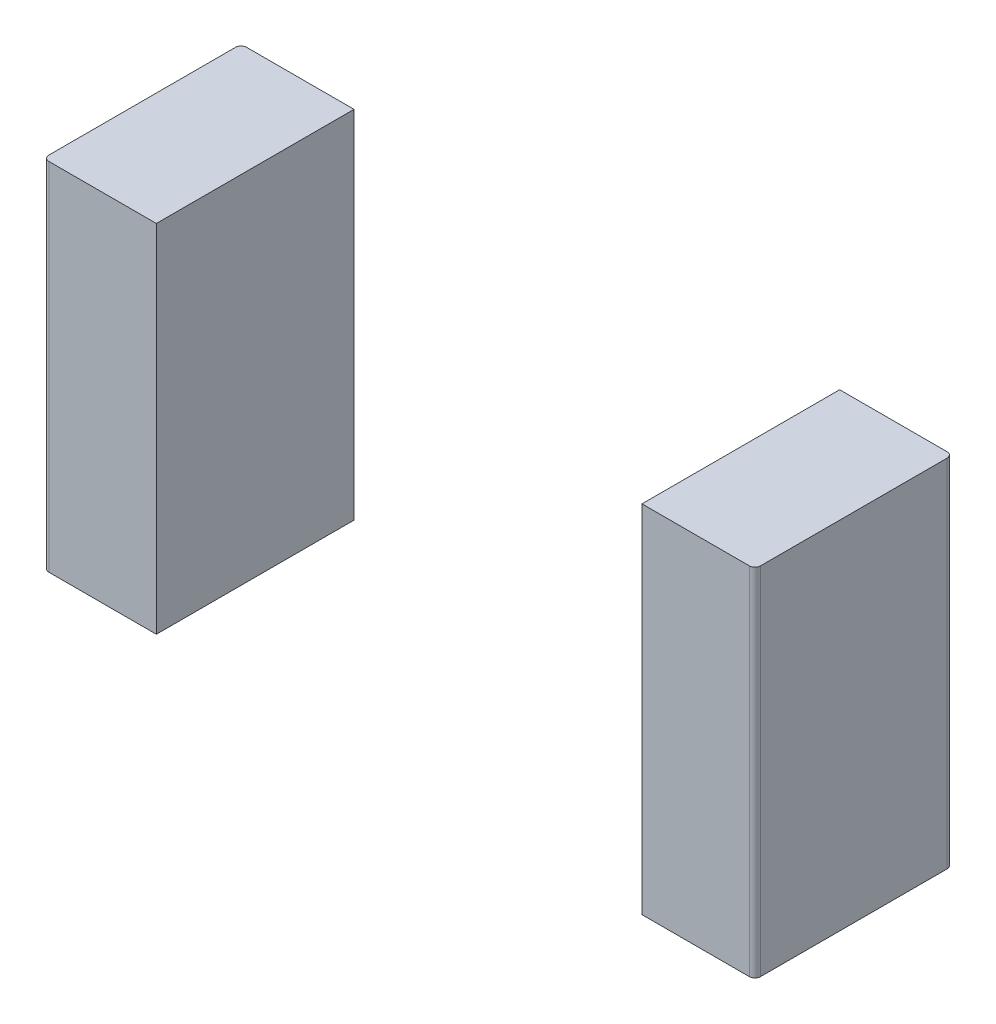
ISO-10303-21;
HEADER;
FILE_DESCRIPTION(('STEP AP214'),'2;1');
FILE_NAME('part.step','',(''),(''),'','','');
FILE_SCHEMA(('AUTOMOTIVE_DESIGN { 1 0 10303 214 1 1 1 1 }'));
ENDSEC;
DATA;
#1=APPLICATION_CONTEXT('core data for automotive mechanical design processes');
#2=APPLICATION_PROTOCOL_DEFINITION('international standard','automotive_design',2000,#1);
#3=PRODUCT_CONTEXT('',#1,'mechanical');
#4=PRODUCT('Part','Part','',(#3));
#5=PRODUCT_RELATED_PRODUCT_CATEGORY('part','',(#4));
#6=PRODUCT_DEFINITION_FORMATION('','',#4);
#7=PRODUCT_DEFINITION_CONTEXT('part definition',#1,'design');
#8=PRODUCT_DEFINITION('design','',#6,#7);
#9=PRODUCT_DEFINITION_SHAPE('','',#8);
#10=(LENGTH_UNIT() NAMED_UNIT(*) SI_UNIT(.MILLI.,.METRE.));
#11=(NAMED_UNIT(*) PLANE_ANGLE_UNIT() SI_UNIT($,.RADIAN.));
#12=(NAMED_UNIT(*) SI_UNIT($,.STERADIAN.) SOLID_ANGLE_UNIT());
#13=UNCERTAINTY_MEASURE_WITH_UNIT(LENGTH_MEASURE(1.E-05),#10,'distance_accuracy_value','');
#14=(GEOMETRIC_REPRESENTATION_CONTEXT(3) GLOBAL_UNCERTAINTY_ASSIGNED_CONTEXT((#13)) GLOBAL_UNIT_ASSIGNED_CONTEXT((#10,
#11,#12)) REPRESENTATION_CONTEXT('',''));
#15=CARTESIAN_POINT('',(0.,0.,0.));
#16=DIRECTION('',(0.,0.,1.));
#17=DIRECTION('',(1.,0.,0.));
#18=AXIS2_PLACEMENT_3D('',#15,#16,#17);
#19=CARTESIAN_POINT('',(-1.575,0.4,0.025));
#20=DIRECTION('',(0.,1.,0.));
#21=DIRECTION('',(0.,0.,1.));
#22=AXIS2_PLACEMENT_3D('',#19,#20,#21);
#23=CYLINDRICAL_SURFACE('',#22,0.025);
#24=CARTESIAN_POINT('',(-1.575,-0.8,0.025));
#25=DIRECTION('',(0.,1.,0.));
#26=DIRECTION('',(0.,0.,1.));
#27=AXIS2_PLACEMENT_3D('',#24,#25,#26);
#28=CIRCLE('',#27,0.025);
#29=CARTESIAN_POINT('',(-1.575,-0.8,0.));
#30=VERTEX_POINT('',#29);
#31=CARTESIAN_POINT('',(-1.6,-0.8,0.025));
#32=VERTEX_POINT('',#31);
#33=EDGE_CURVE('P0_E78',#30,#32,#28,.T.);
#34=ORIENTED_EDGE('',*,*,#33,.T.);
#35=DIRECTION('',(0.,1.,0.));
#36=VECTOR('',#35,1.);
#37=CARTESIAN_POINT('',(-1.6,0.8,0.025));
#38=LINE('',#37,#36);
#39=CARTESIAN_POINT('',(-1.6,0.8,0.025));
#40=VERTEX_POINT('',#39);
#41=EDGE_CURVE('P0_E76',#40,#32,#38,.F.);
#42=ORIENTED_EDGE('',*,*,#41,.F.);
#43=CARTESIAN_POINT('',(-1.575,0.8,0.025));
#44=DIRECTION('',(0.,1.,0.));
#45=DIRECTION('',(0.,0.,1.));
#46=AXIS2_PLACEMENT_3D('',#43,#44,#45);
#47=CIRCLE('',#46,0.025);
#48=CARTESIAN_POINT('',(-1.575,0.8,0.));
#49=VERTEX_POINT('',#48);
#50=EDGE_CURVE('P0_E20',#40,#49,#47,.F.);
#51=ORIENTED_EDGE('',*,*,#50,.T.);
#52=DIRECTION('',(0.,1.,0.));
#53=VECTOR('',#52,1.);
#54=CARTESIAN_POINT('',(-1.575,0.,0.));
#55=LINE('',#54,#53);
#56=EDGE_CURVE('P0_E73',#49,#30,#55,.F.);
#57=ORIENTED_EDGE('',*,*,#56,.T.);
#58=EDGE_LOOP('',(#34,#42,#51,#57));
#59=FACE_BOUND('',#58,.T.);
#60=ADVANCED_FACE('P0_F17',(#59),#23,.T.);
#61=CARTESIAN_POINT('',(-1.575,0.4,0.864));
#62=DIRECTION('',(0.,-1.,0.));
#63=DIRECTION('',(0.,0.,-1.));
#64=AXIS2_PLACEMENT_3D('',#61,#62,#63);
#65=CYLINDRICAL_SURFACE('',#64,0.025);
#66=CARTESIAN_POINT('',(-1.575,0.8,0.864));
#67=DIRECTION('',(0.,-1.,0.));
#68=DIRECTION('',(0.,0.,-1.));
#69=AXIS2_PLACEMENT_3D('',#66,#67,#68);
#70=CIRCLE('',#69,0.025);
#71=CARTESIAN_POINT('',(-1.6,0.8,0.864));
#72=VERTEX_POINT('',#71);
#73=CARTESIAN_POINT('',(-1.575,0.8,0.889));
#74=VERTEX_POINT('',#73);
#75=EDGE_CURVE('P0_E93',#72,#74,#70,.F.);
#76=ORIENTED_EDGE('',*,*,#75,.F.);
#77=DIRECTION('',(0.,1.,0.));
#78=VECTOR('',#77,1.);
#79=CARTESIAN_POINT('',(-1.6,0.8,0.864));
#80=LINE('',#79,#78);
#81=CARTESIAN_POINT('',(-1.6,-0.8,0.864));
#82=VERTEX_POINT('',#81);
#83=EDGE_CURVE('P0_E86',#82,#72,#80,.T.);
#84=ORIENTED_EDGE('',*,*,#83,.F.);
#85=CARTESIAN_POINT('',(-1.575,-0.8,0.864));
#86=DIRECTION('',(0.,-1.,0.));
#87=DIRECTION('',(0.,0.,-1.));
#88=AXIS2_PLACEMENT_3D('',#85,#86,#87);
#89=CIRCLE('',#88,0.025);
#90=CARTESIAN_POINT('',(-1.575,-0.8,0.889));
#91=VERTEX_POINT('',#90);
#92=EDGE_CURVE('P0_E107',#82,#91,#89,.F.);
#93=ORIENTED_EDGE('',*,*,#92,.T.);
#94=DIRECTION('',(0.,1.,0.));
#95=VECTOR('',#94,1.);
#96=CARTESIAN_POINT('',(-1.575,0.,0.889));
#97=LINE('',#96,#95);
#98=EDGE_CURVE('P0_E92',#74,#91,#97,.F.);
#99=ORIENTED_EDGE('',*,*,#98,.F.);
#100=EDGE_LOOP('',(#76,#84,#93,#99));
#101=FACE_BOUND('',#100,.T.);
#102=ADVANCED_FACE('P0_F143',(#101),#65,.T.);
#103=CARTESIAN_POINT('',(-1.6,0.8,0.254));
#104=DIRECTION('',(-1.,0.,0.));
#105=DIRECTION('',(0.,0.,1.));
#106=AXIS2_PLACEMENT_3D('',#103,#104,#105);
#107=PLANE('',#106);
#108=ORIENTED_EDGE('',*,*,#83,.T.);
#109=DIRECTION('',(0.,0.,1.));
#110=VECTOR('',#109,1.);
#111=CARTESIAN_POINT('',(-1.6,0.8,0.));
#112=LINE('',#111,#110);
#113=EDGE_CURVE('P0_E85',#40,#72,#112,.T.);
#114=ORIENTED_EDGE('',*,*,#113,.F.);
#115=ORIENTED_EDGE('',*,*,#41,.T.);
#116=DIRECTION('',(0.,0.,-1.));
#117=VECTOR('',#116,1.);
#118=CARTESIAN_POINT('',(-1.6,-0.8,0.));
#119=LINE('',#118,#117);
#120=EDGE_CURVE('P0_E117',#82,#32,#119,.T.);
#121=ORIENTED_EDGE('',*,*,#120,.F.);
#122=EDGE_LOOP('',(#108,#114,#115,#121));
#123=FACE_BOUND('',#122,.T.);
#124=ADVANCED_FACE('P0_F131',(#123),#107,.T.);
#125=CARTESIAN_POINT('',(-1.346,0.,0.));
#126=DIRECTION('',(0.,0.,1.));
#127=DIRECTION('',(1.,0.,0.));
#128=AXIS2_PLACEMENT_3D('',#125,#126,#127);
#129=PLANE('',#128);
#130=DIRECTION('',(1.,0.,0.));
#131=VECTOR('',#130,1.);
#132=CARTESIAN_POINT('',(-1.092,0.8,0.));
#133=LINE('',#132,#131);
#134=CARTESIAN_POINT('',(-1.092,0.8,0.));
#135=VERTEX_POINT('',#134);
#136=EDGE_CURVE('P0_E81',#135,#49,#133,.F.);
#137=ORIENTED_EDGE('',*,*,#136,.F.);
#138=DIRECTION('',(0.,1.,0.));
#139=VECTOR('',#138,1.);
#140=CARTESIAN_POINT('',(-1.092,-0.8,0.));
#141=LINE('',#140,#139);
#142=CARTESIAN_POINT('',(-1.092,-0.8,0.));
#143=VERTEX_POINT('',#142);
#144=EDGE_CURVE('P0_E115',#143,#135,#141,.T.);
#145=ORIENTED_EDGE('',*,*,#144,.F.);
#146=DIRECTION('',(1.,0.,0.));
#147=VECTOR('',#146,1.);
#148=CARTESIAN_POINT('',(-1.6,-0.8,0.));
#149=LINE('',#148,#147);
#150=EDGE_CURVE('P0_E84',#30,#143,#149,.T.);
#151=ORIENTED_EDGE('',*,*,#150,.F.);
#152=ORIENTED_EDGE('',*,*,#56,.F.);
#153=EDGE_LOOP('',(#137,#145,#151,#152));
#154=FACE_BOUND('',#153,.T.);
#155=ADVANCED_FACE('P0_F80',(#154),#129,.F.);
#156=CARTESIAN_POINT('',(-1.092,0.8,0.));
#157=DIRECTION('',(0.,1.,0.));
#158=DIRECTION('',(0.,0.,1.));
#159=AXIS2_PLACEMENT_3D('',#156,#157,#158);
#160=PLANE('',#159);
#161=DIRECTION('',(0.,0.,-1.));
#162=VECTOR('',#161,1.);
#163=CARTESIAN_POINT('',(-1.092,0.8,0.));
#164=LINE('',#163,#162);
#165=CARTESIAN_POINT('',(-1.092,0.8,0.889));
#166=VERTEX_POINT('',#165);
#167=EDGE_CURVE('P0_E90',#135,#166,#164,.F.);
#168=ORIENTED_EDGE('',*,*,#167,.F.);
#169=ORIENTED_EDGE('',*,*,#136,.T.);
#170=ORIENTED_EDGE('',*,*,#50,.F.);
#171=ORIENTED_EDGE('',*,*,#113,.T.);
#172=ORIENTED_EDGE('',*,*,#75,.T.);
#173=DIRECTION('',(1.,0.,0.));
#174=VECTOR('',#173,1.);
#175=CARTESIAN_POINT('',(-1.346,0.8,0.889));
#176=LINE('',#175,#174);
#177=EDGE_CURVE('P0_E95',#166,#74,#176,.F.);
#178=ORIENTED_EDGE('',*,*,#177,.F.);
#179=EDGE_LOOP('',(#168,#169,#170,#171,#172,#178));
#180=FACE_BOUND('',#179,.T.);
#181=ADVANCED_FACE('P0_F88',(#180),#160,.T.);
#182=CARTESIAN_POINT('',(-1.346,0.,0.889));
#183=DIRECTION('',(0.,0.,1.));
#184=DIRECTION('',(1.,0.,0.));
#185=AXIS2_PLACEMENT_3D('',#182,#183,#184);
#186=PLANE('',#185);
#187=DIRECTION('',(0.,1.,0.));
#188=VECTOR('',#187,1.);
#189=CARTESIAN_POINT('',(-1.092,-0.8,0.889));
#190=LINE('',#189,#188);
#191=CARTESIAN_POINT('',(-1.092,-0.8,0.889));
#192=VERTEX_POINT('',#191);
#193=EDGE_CURVE('P0_E26',#166,#192,#190,.F.);
#194=ORIENTED_EDGE('',*,*,#193,.F.);
#195=ORIENTED_EDGE('',*,*,#177,.T.);
#196=ORIENTED_EDGE('',*,*,#98,.T.);
#197=DIRECTION('',(1.,0.,0.));
#198=VECTOR('',#197,1.);
#199=CARTESIAN_POINT('',(-1.6,-0.8,0.889));
#200=LINE('',#199,#198);
#201=EDGE_CURVE('P0_E35',#192,#91,#200,.F.);
#202=ORIENTED_EDGE('',*,*,#201,.F.);
#203=EDGE_LOOP('',(#194,#195,#196,#202));
#204=FACE_BOUND('',#203,.T.);
#205=ADVANCED_FACE('P0_F140',(#204),#186,.T.);
#206=CARTESIAN_POINT('',(-1.6,-0.8,0.));
#207=DIRECTION('',(0.,-1.,0.));
#208=DIRECTION('',(0.,0.,-1.));
#209=AXIS2_PLACEMENT_3D('',#206,#207,#208);
#210=PLANE('',#209);
#211=ORIENTED_EDGE('',*,*,#92,.F.);
#212=ORIENTED_EDGE('',*,*,#120,.T.);
#213=ORIENTED_EDGE('',*,*,#33,.F.);
#214=ORIENTED_EDGE('',*,*,#150,.T.);
#215=DIRECTION('',(0.,0.,-1.));
#216=VECTOR('',#215,1.);
#217=CARTESIAN_POINT('',(-1.092,-0.8,0.));
#218=LINE('',#217,#216);
#219=EDGE_CURVE('P0_E11',#192,#143,#218,.T.);
#220=ORIENTED_EDGE('',*,*,#219,.F.);
#221=ORIENTED_EDGE('',*,*,#201,.T.);
#222=EDGE_LOOP('',(#211,#212,#213,#214,#220,#221));
#223=FACE_BOUND('',#222,.T.);
#224=ADVANCED_FACE('P0_F132',(#223),#210,.T.);
#225=CARTESIAN_POINT('',(-1.092,-0.8,0.));
#226=DIRECTION('',(1.,0.,0.));
#227=DIRECTION('',(0.,0.,-1.));
#228=AXIS2_PLACEMENT_3D('',#225,#226,#227);
#229=PLANE('',#228);
#230=ORIENTED_EDGE('',*,*,#193,.T.);
#231=ORIENTED_EDGE('',*,*,#219,.T.);
#232=ORIENTED_EDGE('',*,*,#144,.T.);
#233=ORIENTED_EDGE('',*,*,#167,.T.);
#234=EDGE_LOOP('',(#230,#231,#232,#233));
#235=FACE_BOUND('',#234,.T.);
#236=ADVANCED_FACE('P0_F139',(#235),#229,.T.);
#237=CLOSED_SHELL('',(#60,#102,#124,#155,#181,#205,#224,#236));
#238=MANIFOLD_SOLID_BREP('P0_B1',#237);
#239=CARTESIAN_POINT('',(1.575,-0.4,0.025));
#240=DIRECTION('',(0.,-1.,0.));
#241=DIRECTION('',(0.,0.,-1.));
#242=AXIS2_PLACEMENT_3D('',#239,#240,#241);
#243=CYLINDRICAL_SURFACE('',#242,0.025);
#244=CARTESIAN_POINT('',(1.575,0.8,0.025));
#245=DIRECTION('',(0.,-1.,0.));
#246=DIRECTION('',(0.,0.,-1.));
#247=AXIS2_PLACEMENT_3D('',#244,#245,#246);
#248=CIRCLE('',#247,0.025);
#249=CARTESIAN_POINT('',(1.575,0.8,0.));
#250=VERTEX_POINT('',#249);
#251=CARTESIAN_POINT('',(1.6,0.8,0.025));
#252=VERTEX_POINT('',#251);
#253=EDGE_CURVE('P1_E78',#250,#252,#248,.T.);
#254=ORIENTED_EDGE('',*,*,#253,.T.);
#255=DIRECTION('',(0.,1.,0.));
#256=VECTOR('',#255,1.);
#257=CARTESIAN_POINT('',(1.6,-0.8,0.025));
#258=LINE('',#257,#256);
#259=CARTESIAN_POINT('',(1.6,-0.8,0.025));
#260=VERTEX_POINT('',#259);
#261=EDGE_CURVE('P1_E76',#260,#252,#258,.T.);
#262=ORIENTED_EDGE('',*,*,#261,.F.);
#263=CARTESIAN_POINT('',(1.575,-0.8,0.025));
#264=DIRECTION('',(0.,-1.,0.));
#265=DIRECTION('',(0.,0.,-1.));
#266=AXIS2_PLACEMENT_3D('',#263,#264,#265);
#267=CIRCLE('',#266,0.025);
#268=CARTESIAN_POINT('',(1.575,-0.8,0.));
#269=VERTEX_POINT('',#268);
#270=EDGE_CURVE('P1_E20',#260,#269,#267,.F.);
#271=ORIENTED_EDGE('',*,*,#270,.T.);
#272=DIRECTION('',(0.,1.,0.));
#273=VECTOR('',#272,1.);
#274=CARTESIAN_POINT('',(1.575,0.,0.));
#275=LINE('',#274,#273);
#276=EDGE_CURVE('P1_E73',#269,#250,#275,.T.);
#277=ORIENTED_EDGE('',*,*,#276,.T.);
#278=EDGE_LOOP('',(#254,#262,#271,#277));
#279=FACE_BOUND('',#278,.T.);
#280=ADVANCED_FACE('P1_F17',(#279),#243,.T.);
#281=CARTESIAN_POINT('',(1.575,-0.4,0.864));
#282=DIRECTION('',(0.,1.,0.));
#283=DIRECTION('',(0.,0.,1.));
#284=AXIS2_PLACEMENT_3D('',#281,#282,#283);
#285=CYLINDRICAL_SURFACE('',#284,0.025);
#286=CARTESIAN_POINT('',(1.575,-0.8,0.864));
#287=DIRECTION('',(0.,1.,0.));
#288=DIRECTION('',(0.,0.,1.));
#289=AXIS2_PLACEMENT_3D('',#286,#287,#288);
#290=CIRCLE('',#289,0.025);
#291=CARTESIAN_POINT('',(1.6,-0.8,0.864));
#292=VERTEX_POINT('',#291);
#293=CARTESIAN_POINT('',(1.575,-0.8,0.889));
#294=VERTEX_POINT('',#293);
#295=EDGE_CURVE('P1_E85',#292,#294,#290,.F.);
#296=ORIENTED_EDGE('',*,*,#295,.F.);
#297=DIRECTION('',(0.,1.,0.));
#298=VECTOR('',#297,1.);
#299=CARTESIAN_POINT('',(1.6,-0.8,0.864));
#300=LINE('',#299,#298);
#301=CARTESIAN_POINT('',(1.6,0.8,0.864));
#302=VERTEX_POINT('',#301);
#303=EDGE_CURVE('P1_E113',#302,#292,#300,.F.);
#304=ORIENTED_EDGE('',*,*,#303,.F.);
#305=CARTESIAN_POINT('',(1.575,0.8,0.864));
#306=DIRECTION('',(0.,1.,0.));
#307=DIRECTION('',(0.,0.,1.));
#308=AXIS2_PLACEMENT_3D('',#305,#306,#307);
#309=CIRCLE('',#308,0.025);
#310=CARTESIAN_POINT('',(1.575,0.8,0.889));
#311=VERTEX_POINT('',#310);
#312=EDGE_CURVE('P1_E116',#302,#311,#309,.F.);
#313=ORIENTED_EDGE('',*,*,#312,.T.);
#314=DIRECTION('',(0.,1.,0.));
#315=VECTOR('',#314,1.);
#316=CARTESIAN_POINT('',(1.575,0.,0.889));
#317=LINE('',#316,#315);
#318=EDGE_CURVE('P1_E93',#294,#311,#317,.T.);
#319=ORIENTED_EDGE('',*,*,#318,.F.);
#320=EDGE_LOOP('',(#296,#304,#313,#319));
#321=FACE_BOUND('',#320,.T.);
#322=ADVANCED_FACE('P1_F143',(#321),#285,.T.);
#323=CARTESIAN_POINT('',(1.6,-0.8,0.));
#324=DIRECTION('',(1.,0.,0.));
#325=DIRECTION('',(0.,0.,-1.));
#326=AXIS2_PLACEMENT_3D('',#323,#324,#325);
#327=PLANE('',#326);
#328=ORIENTED_EDGE('',*,*,#261,.T.);
#329=DIRECTION('',(0.,0.,1.));
#330=VECTOR('',#329,1.);
#331=CARTESIAN_POINT('',(1.6,0.8,0.));
#332=LINE('',#331,#330);
#333=EDGE_CURVE('P1_E120',#302,#252,#332,.F.);
#334=ORIENTED_EDGE('',*,*,#333,.F.);
#335=ORIENTED_EDGE('',*,*,#303,.T.);
#336=DIRECTION('',(0.,0.,-1.));
#337=VECTOR('',#336,1.);
#338=CARTESIAN_POINT('',(1.6,-0.8,0.));
#339=LINE('',#338,#337);
#340=EDGE_CURVE('P1_E91',#260,#292,#339,.F.);
#341=ORIENTED_EDGE('',*,*,#340,.F.);
#342=EDGE_LOOP('',(#328,#334,#335,#341));
#343=FACE_BOUND('',#342,.T.);
#344=ADVANCED_FACE('P1_F130',(#343),#327,.T.);
#345=CARTESIAN_POINT('',(1.346,0.,0.));
#346=DIRECTION('',(0.,0.,1.));
#347=DIRECTION('',(1.,0.,0.));
#348=AXIS2_PLACEMENT_3D('',#345,#346,#347);
#349=PLANE('',#348);
#350=DIRECTION('',(1.,0.,0.));
#351=VECTOR('',#350,1.);
#352=CARTESIAN_POINT('',(1.092,-0.8,0.));
#353=LINE('',#352,#351);
#354=CARTESIAN_POINT('',(1.092,-0.8,0.));
#355=VERTEX_POINT('',#354);
#356=EDGE_CURVE('P1_E81',#355,#269,#353,.T.);
#357=ORIENTED_EDGE('',*,*,#356,.F.);
#358=DIRECTION('',(0.,1.,0.));
#359=VECTOR('',#358,1.);
#360=CARTESIAN_POINT('',(1.092,0.8,0.));
#361=LINE('',#360,#359);
#362=CARTESIAN_POINT('',(1.092,0.8,0.));
#363=VERTEX_POINT('',#362);
#364=EDGE_CURVE('P1_E109',#363,#355,#361,.F.);
#365=ORIENTED_EDGE('',*,*,#364,.F.);
#366=DIRECTION('',(1.,0.,0.));
#367=VECTOR('',#366,1.);
#368=CARTESIAN_POINT('',(1.6,0.8,0.));
#369=LINE('',#368,#367);
#370=EDGE_CURVE('P1_E84',#250,#363,#369,.F.);
#371=ORIENTED_EDGE('',*,*,#370,.F.);
#372=ORIENTED_EDGE('',*,*,#276,.F.);
#373=EDGE_LOOP('',(#357,#365,#371,#372));
#374=FACE_BOUND('',#373,.T.);
#375=ADVANCED_FACE('P1_F80',(#374),#349,.F.);
#376=CARTESIAN_POINT('',(1.092,-0.8,0.));
#377=DIRECTION('',(0.,-1.,0.));
#378=DIRECTION('',(0.,0.,-1.));
#379=AXIS2_PLACEMENT_3D('',#376,#377,#378);
#380=PLANE('',#379);
#381=ORIENTED_EDGE('',*,*,#270,.F.);
#382=ORIENTED_EDGE('',*,*,#340,.T.);
#383=ORIENTED_EDGE('',*,*,#295,.T.);
#384=DIRECTION('',(1.,0.,0.));
#385=VECTOR('',#384,1.);
#386=CARTESIAN_POINT('',(1.346,-0.8,0.889));
#387=LINE('',#386,#385);
#388=CARTESIAN_POINT('',(1.092,-0.8,0.889));
#389=VERTEX_POINT('',#388);
#390=EDGE_CURVE('P1_E101',#389,#294,#387,.T.);
#391=ORIENTED_EDGE('',*,*,#390,.F.);
#392=DIRECTION('',(0.,0.,1.));
#393=VECTOR('',#392,1.);
#394=CARTESIAN_POINT('',(1.092,-0.8,0.));
#395=LINE('',#394,#393);
#396=EDGE_CURVE('P1_E89',#355,#389,#395,.T.);
#397=ORIENTED_EDGE('',*,*,#396,.F.);
#398=ORIENTED_EDGE('',*,*,#356,.T.);
#399=EDGE_LOOP('',(#381,#382,#383,#391,#397,#398));
#400=FACE_BOUND('',#399,.T.);
#401=ADVANCED_FACE('P1_F87',(#400),#380,.T.);
#402=CARTESIAN_POINT('',(1.346,0.,0.889));
#403=DIRECTION('',(0.,0.,1.));
#404=DIRECTION('',(1.,0.,0.));
#405=AXIS2_PLACEMENT_3D('',#402,#403,#404);
#406=PLANE('',#405);
#407=DIRECTION('',(0.,1.,0.));
#408=VECTOR('',#407,1.);
#409=CARTESIAN_POINT('',(1.092,0.8,0.889));
#410=LINE('',#409,#408);
#411=CARTESIAN_POINT('',(1.092,0.8,0.889));
#412=VERTEX_POINT('',#411);
#413=EDGE_CURVE('P1_E26',#389,#412,#410,.T.);
#414=ORIENTED_EDGE('',*,*,#413,.F.);
#415=ORIENTED_EDGE('',*,*,#390,.T.);
#416=ORIENTED_EDGE('',*,*,#318,.T.);
#417=DIRECTION('',(1.,0.,0.));
#418=VECTOR('',#417,1.);
#419=CARTESIAN_POINT('',(1.6,0.8,0.889));
#420=LINE('',#419,#418);
#421=EDGE_CURVE('P1_E35',#412,#311,#420,.T.);
#422=ORIENTED_EDGE('',*,*,#421,.F.);
#423=EDGE_LOOP('',(#414,#415,#416,#422));
#424=FACE_BOUND('',#423,.T.);
#425=ADVANCED_FACE('P1_F141',(#424),#406,.T.);
#426=CARTESIAN_POINT('',(1.6,0.8,0.));
#427=DIRECTION('',(0.,1.,0.));
#428=DIRECTION('',(0.,0.,1.));
#429=AXIS2_PLACEMENT_3D('',#426,#427,#428);
#430=PLANE('',#429);
#431=DIRECTION('',(0.,0.,1.));
#432=VECTOR('',#431,1.);
#433=CARTESIAN_POINT('',(1.092,0.8,0.));
#434=LINE('',#433,#432);
#435=EDGE_CURVE('P1_E11',#412,#363,#434,.F.);
#436=ORIENTED_EDGE('',*,*,#435,.F.);
#437=ORIENTED_EDGE('',*,*,#421,.T.);
#438=ORIENTED_EDGE('',*,*,#312,.F.);
#439=ORIENTED_EDGE('',*,*,#333,.T.);
#440=ORIENTED_EDGE('',*,*,#253,.F.);
#441=ORIENTED_EDGE('',*,*,#370,.T.);
#442=EDGE_LOOP('',(#436,#437,#438,#439,#440,#441));
#443=FACE_BOUND('',#442,.T.);
#444=ADVANCED_FACE('P1_F131',(#443),#430,.T.);
#445=CARTESIAN_POINT('',(1.092,0.8,0.));
#446=DIRECTION('',(-1.,0.,0.));
#447=DIRECTION('',(0.,0.,1.));
#448=AXIS2_PLACEMENT_3D('',#445,#446,#447);
#449=PLANE('',#448);
#450=ORIENTED_EDGE('',*,*,#413,.T.);
#451=ORIENTED_EDGE('',*,*,#435,.T.);
#452=ORIENTED_EDGE('',*,*,#364,.T.);
#453=ORIENTED_EDGE('',*,*,#396,.T.);
#454=EDGE_LOOP('',(#450,#451,#452,#453));
#455=FACE_BOUND('',#454,.T.);
#456=ADVANCED_FACE('P1_F140',(#455),#449,.T.);
#457=CLOSED_SHELL('',(#280,#322,#344,#375,#401,#425,#444,#456));
#458=MANIFOLD_SOLID_BREP('P1_B1',#457);
#459=ADVANCED_BREP_SHAPE_REPRESENTATION('',(#18,#238,#458),#14);
#460=SHAPE_DEFINITION_REPRESENTATION(#9,#459);
ENDSEC;
END-ISO-10303-21;
